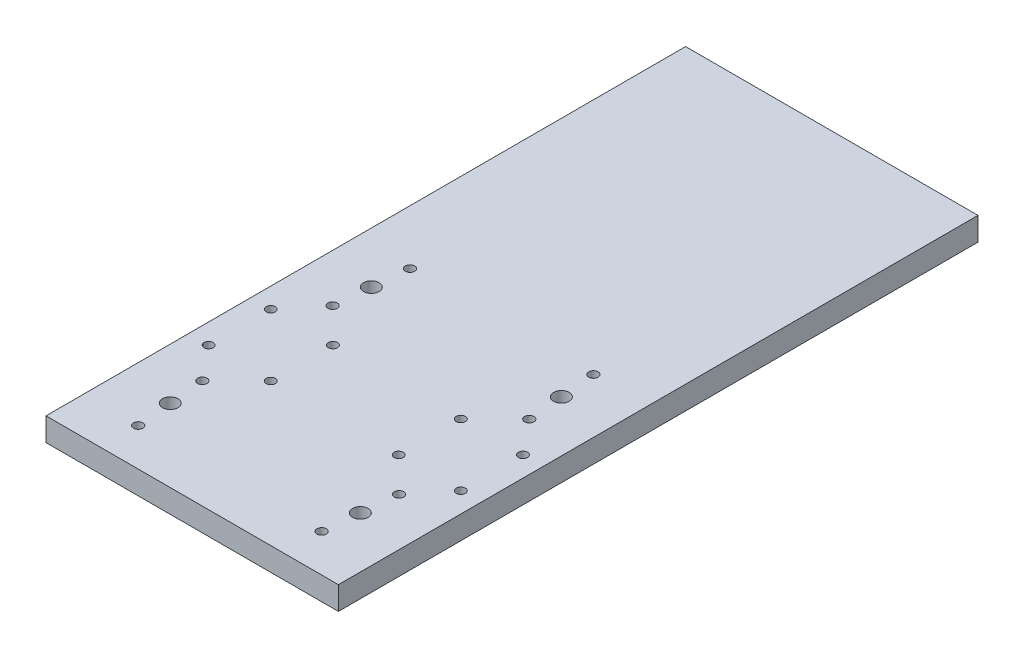
ISO-10303-21;
HEADER;
FILE_DESCRIPTION(('STEP AP214'),'2;1');
FILE_NAME('part.step','',(''),(''),'','','');
FILE_SCHEMA(('AUTOMOTIVE_DESIGN { 1 0 10303 214 1 1 1 1 }'));
ENDSEC;
DATA;
#1=APPLICATION_CONTEXT('core data for automotive mechanical design processes');
#2=APPLICATION_PROTOCOL_DEFINITION('international standard','automotive_design',2000,#1);
#3=PRODUCT_CONTEXT('',#1,'mechanical');
#4=PRODUCT('Part','Part','',(#3));
#5=PRODUCT_RELATED_PRODUCT_CATEGORY('part','',(#4));
#6=PRODUCT_DEFINITION_FORMATION('','',#4);
#7=PRODUCT_DEFINITION_CONTEXT('part definition',#1,'design');
#8=PRODUCT_DEFINITION('design','',#6,#7);
#9=PRODUCT_DEFINITION_SHAPE('','',#8);
#10=(LENGTH_UNIT() NAMED_UNIT(*) SI_UNIT(.MILLI.,.METRE.));
#11=(NAMED_UNIT(*) PLANE_ANGLE_UNIT() SI_UNIT($,.RADIAN.));
#12=(NAMED_UNIT(*) SI_UNIT($,.STERADIAN.) SOLID_ANGLE_UNIT());
#13=UNCERTAINTY_MEASURE_WITH_UNIT(LENGTH_MEASURE(1.E-05),#10,'distance_accuracy_value','');
#14=(GEOMETRIC_REPRESENTATION_CONTEXT(3) GLOBAL_UNCERTAINTY_ASSIGNED_CONTEXT((#13)) GLOBAL_UNIT_ASSIGNED_CONTEXT((#10,
#11,#12)) REPRESENTATION_CONTEXT('',''));
#15=CARTESIAN_POINT('',(0.,0.,0.));
#16=DIRECTION('',(0.,0.,1.));
#17=DIRECTION('',(1.,0.,0.));
#18=AXIS2_PLACEMENT_3D('',#15,#16,#17);
#19=CARTESIAN_POINT('',(0.,6.35,0.));
#20=DIRECTION('',(0.,1.,0.));
#21=DIRECTION('',(0.,0.,1.));
#22=AXIS2_PLACEMENT_3D('',#19,#20,#21);
#23=PLANE('',#22);
#24=CARTESIAN_POINT('',(69.,6.35,97.));
#25=DIRECTION('',(0.,1.,0.));
#26=DIRECTION('',(0.,0.,1.));
#27=AXIS2_PLACEMENT_3D('',#24,#25,#26);
#28=CIRCLE('',#27,2.49999999999999);
#29=CARTESIAN_POINT('',(69.,6.35,99.5));
#30=VERTEX_POINT('',#29);
#31=EDGE_CURVE('E230',#30,#30,#28,.T.);
#32=ORIENTED_EDGE('',*,*,#31,.F.);
#33=EDGE_LOOP('',(#32));
#34=FACE_BOUND('',#33,.T.);
#35=CARTESIAN_POINT('',(35.,6.35,63.));
#36=DIRECTION('',(0.,1.,0.));
#37=DIRECTION('',(0.,0.,1.));
#38=AXIS2_PLACEMENT_3D('',#35,#36,#37);
#39=CIRCLE('',#38,2.49999999999999);
#40=CARTESIAN_POINT('',(35.,6.35,65.5));
#41=VERTEX_POINT('',#40);
#42=EDGE_CURVE('E224',#41,#41,#39,.T.);
#43=ORIENTED_EDGE('',*,*,#42,.F.);
#44=EDGE_LOOP('',(#43));
#45=FACE_BOUND('',#44,.T.);
#46=CARTESIAN_POINT('',(35.,6.35,97.));
#47=DIRECTION('',(0.,1.,0.));
#48=DIRECTION('',(0.,0.,1.));
#49=AXIS2_PLACEMENT_3D('',#46,#47,#48);
#50=CIRCLE('',#49,2.49999999999999);
#51=CARTESIAN_POINT('',(35.,6.35,99.5));
#52=VERTEX_POINT('',#51);
#53=EDGE_CURVE('E218',#52,#52,#50,.T.);
#54=ORIENTED_EDGE('',*,*,#53,.F.);
#55=EDGE_LOOP('',(#54));
#56=FACE_BOUND('',#55,.T.);
#57=CARTESIAN_POINT('',(69.,6.35,63.));
#58=DIRECTION('',(0.,1.,0.));
#59=DIRECTION('',(0.,0.,1.));
#60=AXIS2_PLACEMENT_3D('',#57,#58,#59);
#61=CIRCLE('',#60,2.49999999999999);
#62=CARTESIAN_POINT('',(69.,6.35,65.5));
#63=VERTEX_POINT('',#62);
#64=EDGE_CURVE('E212',#63,#63,#61,.T.);
#65=ORIENTED_EDGE('',*,*,#64,.F.);
#66=EDGE_LOOP('',(#65));
#67=FACE_BOUND('',#66,.T.);
#68=CARTESIAN_POINT('',(-69.,6.35,63.));
#69=DIRECTION('',(0.,1.,0.));
#70=DIRECTION('',(0.,0.,1.));
#71=AXIS2_PLACEMENT_3D('',#68,#69,#70);
#72=CIRCLE('',#71,2.49999999999999);
#73=CARTESIAN_POINT('',(-69.,6.35,65.5));
#74=VERTEX_POINT('',#73);
#75=EDGE_CURVE('E206',#74,#74,#72,.T.);
#76=ORIENTED_EDGE('',*,*,#75,.F.);
#77=EDGE_LOOP('',(#76));
#78=FACE_BOUND('',#77,.T.);
#79=CARTESIAN_POINT('',(-35.,6.35,97.));
#80=DIRECTION('',(0.,1.,0.));
#81=DIRECTION('',(0.,0.,1.));
#82=AXIS2_PLACEMENT_3D('',#79,#80,#81);
#83=CIRCLE('',#82,2.49999999999999);
#84=CARTESIAN_POINT('',(-35.,6.35,99.5));
#85=VERTEX_POINT('',#84);
#86=EDGE_CURVE('E200',#85,#85,#83,.T.);
#87=ORIENTED_EDGE('',*,*,#86,.F.);
#88=EDGE_LOOP('',(#87));
#89=FACE_BOUND('',#88,.T.);
#90=CARTESIAN_POINT('',(-35.,6.35,63.));
#91=DIRECTION('',(0.,1.,0.));
#92=DIRECTION('',(0.,0.,1.));
#93=AXIS2_PLACEMENT_3D('',#90,#91,#92);
#94=CIRCLE('',#93,2.49999999999999);
#95=CARTESIAN_POINT('',(-35.,6.35,65.5));
#96=VERTEX_POINT('',#95);
#97=EDGE_CURVE('E194',#96,#96,#94,.T.);
#98=ORIENTED_EDGE('',*,*,#97,.F.);
#99=EDGE_LOOP('',(#98));
#100=FACE_BOUND('',#99,.T.);
#101=CARTESIAN_POINT('',(-69.,6.35,97.));
#102=DIRECTION('',(0.,1.,0.));
#103=DIRECTION('',(0.,0.,1.));
#104=AXIS2_PLACEMENT_3D('',#101,#102,#103);
#105=CIRCLE('',#104,2.49999999999999);
#106=CARTESIAN_POINT('',(-69.,6.35,99.5));
#107=VERTEX_POINT('',#106);
#108=EDGE_CURVE('E188',#107,#107,#105,.T.);
#109=ORIENTED_EDGE('',*,*,#108,.F.);
#110=EDGE_LOOP('',(#109));
#111=FACE_BOUND('',#110,.T.);
#112=CARTESIAN_POINT('',(50.1806296318612,6.35,154.364720278474));
#113=DIRECTION('',(0.,1.,0.));
#114=DIRECTION('',(0.,0.,1.));
#115=AXIS2_PLACEMENT_3D('',#112,#113,#114);
#116=CIRCLE('',#115,2.5527);
#117=CARTESIAN_POINT('',(50.1806296318612,6.35,156.917420278474));
#118=VERTEX_POINT('',#117);
#119=EDGE_CURVE('E182',#118,#118,#116,.T.);
#120=ORIENTED_EDGE('',*,*,#119,.F.);
#121=EDGE_LOOP('',(#120));
#122=FACE_BOUND('',#121,.T.);
#123=CARTESIAN_POINT('',(53.8193703681388,6.35,115.635279721526));
#124=DIRECTION('',(0.,1.,0.));
#125=DIRECTION('',(0.,0.,1.));
#126=AXIS2_PLACEMENT_3D('',#123,#124,#125);
#127=CIRCLE('',#126,2.5527);
#128=CARTESIAN_POINT('',(53.8193703681388,6.35,118.187979721526));
#129=VERTEX_POINT('',#128);
#130=EDGE_CURVE('E176',#129,#129,#127,.T.);
#131=ORIENTED_EDGE('',*,*,#130,.F.);
#132=EDGE_LOOP('',(#131));
#133=FACE_BOUND('',#132,.T.);
#134=CARTESIAN_POINT('',(50.1806296318611,6.35,5.63527972155062));
#135=DIRECTION('',(0.,1.,0.));
#136=DIRECTION('',(0.,0.,1.));
#137=AXIS2_PLACEMENT_3D('',#134,#135,#136);
#138=CIRCLE('',#137,2.5527);
#139=CARTESIAN_POINT('',(50.1806296318611,6.35,8.18797972155062));
#140=VERTEX_POINT('',#139);
#141=EDGE_CURVE('E170',#140,#140,#138,.T.);
#142=ORIENTED_EDGE('',*,*,#141,.F.);
#143=EDGE_LOOP('',(#142));
#144=FACE_BOUND('',#143,.T.);
#145=CARTESIAN_POINT('',(53.8193703681388,6.35,44.3647202784984));
#146=DIRECTION('',(0.,1.,0.));
#147=DIRECTION('',(0.,0.,1.));
#148=AXIS2_PLACEMENT_3D('',#145,#146,#147);
#149=CIRCLE('',#148,2.5527);
#150=CARTESIAN_POINT('',(53.8193703681388,6.35,46.9174202784984));
#151=VERTEX_POINT('',#150);
#152=EDGE_CURVE('E164',#151,#151,#149,.T.);
#153=ORIENTED_EDGE('',*,*,#152,.F.);
#154=EDGE_LOOP('',(#153));
#155=FACE_BOUND('',#154,.T.);
#156=CARTESIAN_POINT('',(-53.8193703680898,6.35,44.3647202784985));
#157=DIRECTION('',(0.,1.,0.));
#158=DIRECTION('',(0.,0.,1.));
#159=AXIS2_PLACEMENT_3D('',#156,#157,#158);
#160=CIRCLE('',#159,2.5527);
#161=CARTESIAN_POINT('',(-53.8193703680898,6.35,46.9174202784985));
#162=VERTEX_POINT('',#161);
#163=EDGE_CURVE('E158',#162,#162,#160,.T.);
#164=ORIENTED_EDGE('',*,*,#163,.F.);
#165=EDGE_LOOP('',(#164));
#166=FACE_BOUND('',#165,.T.);
#167=CARTESIAN_POINT('',(-50.1806296318122,6.35,5.63527972155065));
#168=DIRECTION('',(0.,1.,0.));
#169=DIRECTION('',(0.,0.,1.));
#170=AXIS2_PLACEMENT_3D('',#167,#168,#169);
#171=CIRCLE('',#170,2.5527);
#172=CARTESIAN_POINT('',(-50.1806296318122,6.35,8.18797972155064));
#173=VERTEX_POINT('',#172);
#174=EDGE_CURVE('E152',#173,#173,#171,.T.);
#175=ORIENTED_EDGE('',*,*,#174,.F.);
#176=EDGE_LOOP('',(#175));
#177=FACE_BOUND('',#176,.T.);
#178=CARTESIAN_POINT('',(-53.8193703680898,6.35,115.635279721526));
#179=DIRECTION('',(0.,1.,0.));
#180=DIRECTION('',(0.,0.,1.));
#181=AXIS2_PLACEMENT_3D('',#178,#179,#180);
#182=CIRCLE('',#181,2.5527);
#183=CARTESIAN_POINT('',(-53.8193703680898,6.35,118.187979721526));
#184=VERTEX_POINT('',#183);
#185=EDGE_CURVE('E146',#184,#184,#182,.T.);
#186=ORIENTED_EDGE('',*,*,#185,.F.);
#187=EDGE_LOOP('',(#186));
#188=FACE_BOUND('',#187,.T.);
#189=CARTESIAN_POINT('',(-50.1806296318121,6.35,154.364720278474));
#190=DIRECTION('',(0.,1.,0.));
#191=DIRECTION('',(0.,0.,1.));
#192=AXIS2_PLACEMENT_3D('',#189,#190,#191);
#193=CIRCLE('',#192,2.5527);
#194=CARTESIAN_POINT('',(-50.1806296318121,6.35,156.917420278474));
#195=VERTEX_POINT('',#194);
#196=EDGE_CURVE('E140',#195,#195,#193,.T.);
#197=ORIENTED_EDGE('',*,*,#196,.F.);
#198=EDGE_LOOP('',(#197));
#199=FACE_BOUND('',#198,.T.);
#200=CARTESIAN_POINT('',(-52.,6.35,135.));
#201=DIRECTION('',(0.,1.,0.));
#202=DIRECTION('',(0.,0.,-1.));
#203=AXIS2_PLACEMENT_3D('',#200,#201,#202);
#204=CIRCLE('',#203,4.25000000000002);
#205=CARTESIAN_POINT('',(-52.,6.35,130.75));
#206=VERTEX_POINT('',#205);
#207=EDGE_CURVE('E123',#206,#206,#204,.T.);
#208=ORIENTED_EDGE('',*,*,#207,.F.);
#209=EDGE_LOOP('',(#208));
#210=FACE_BOUND('',#209,.T.);
#211=CARTESIAN_POINT('',(52.,6.35,135.));
#212=DIRECTION('',(0.,1.,0.));
#213=DIRECTION('',(0.,0.,1.));
#214=AXIS2_PLACEMENT_3D('',#211,#212,#213);
#215=CIRCLE('',#214,4.25000000000002);
#216=CARTESIAN_POINT('',(52.,6.35,139.25));
#217=VERTEX_POINT('',#216);
#218=EDGE_CURVE('E102',#217,#217,#215,.T.);
#219=ORIENTED_EDGE('',*,*,#218,.F.);
#220=EDGE_LOOP('',(#219));
#221=FACE_BOUND('',#220,.T.);
#222=DIRECTION('',(0.,0.,1.));
#223=VECTOR('',#222,1.);
#224=CARTESIAN_POINT('',(-80.,6.35,175.));
#225=LINE('',#224,#223);
#226=CARTESIAN_POINT('',(-80.,6.35,-175.));
#227=VERTEX_POINT('',#226);
#228=CARTESIAN_POINT('',(-80.,6.35,175.));
#229=VERTEX_POINT('',#228);
#230=EDGE_CURVE('E87',#227,#229,#225,.T.);
#231=ORIENTED_EDGE('',*,*,#230,.T.);
#232=DIRECTION('',(1.,0.,0.));
#233=VECTOR('',#232,1.);
#234=CARTESIAN_POINT('',(80.,6.35,175.));
#235=LINE('',#234,#233);
#236=CARTESIAN_POINT('',(80.,6.35,175.));
#237=VERTEX_POINT('',#236);
#238=EDGE_CURVE('E82',#229,#237,#235,.T.);
#239=ORIENTED_EDGE('',*,*,#238,.T.);
#240=DIRECTION('',(0.,0.,-1.));
#241=VECTOR('',#240,1.);
#242=CARTESIAN_POINT('',(80.,6.35,175.));
#243=LINE('',#242,#241);
#244=CARTESIAN_POINT('',(80.,6.35,-175.));
#245=VERTEX_POINT('',#244);
#246=EDGE_CURVE('E85',#237,#245,#243,.T.);
#247=ORIENTED_EDGE('',*,*,#246,.T.);
#248=DIRECTION('',(-1.,0.,0.));
#249=VECTOR('',#248,1.);
#250=CARTESIAN_POINT('',(80.,6.35,-175.));
#251=LINE('',#250,#249);
#252=EDGE_CURVE('E52',#245,#227,#251,.T.);
#253=ORIENTED_EDGE('',*,*,#252,.T.);
#254=EDGE_LOOP('',(#231,#239,#247,#253));
#255=FACE_BOUND('',#254,.T.);
#256=CARTESIAN_POINT('',(52.,6.35,25.));
#257=DIRECTION('',(0.,1.,0.));
#258=DIRECTION('',(0.,0.,-1.));
#259=AXIS2_PLACEMENT_3D('',#256,#257,#258);
#260=CIRCLE('',#259,4.25000000000002);
#261=CARTESIAN_POINT('',(52.,6.35,20.75));
#262=VERTEX_POINT('',#261);
#263=EDGE_CURVE('E117',#262,#262,#260,.T.);
#264=ORIENTED_EDGE('',*,*,#263,.F.);
#265=EDGE_LOOP('',(#264));
#266=FACE_BOUND('',#265,.T.);
#267=CARTESIAN_POINT('',(-52.,6.35,25.));
#268=DIRECTION('',(0.,1.,0.));
#269=DIRECTION('',(0.,0.,1.));
#270=AXIS2_PLACEMENT_3D('',#267,#268,#269);
#271=CIRCLE('',#270,4.25000000000002);
#272=CARTESIAN_POINT('',(-52.,6.35,29.25));
#273=VERTEX_POINT('',#272);
#274=EDGE_CURVE('E129',#273,#273,#271,.T.);
#275=ORIENTED_EDGE('',*,*,#274,.F.);
#276=EDGE_LOOP('',(#275));
#277=FACE_BOUND('',#276,.T.);
#278=ADVANCED_FACE('F35',(#34,#45,#56,#67,#78,#89,#100,#111,#122,#133,#144,#155,#166,#177,#188,
#199,#210,#221,#255,#266,#277),#23,.T.);
#279=CARTESIAN_POINT('',(0.,-6.35,0.));
#280=DIRECTION('',(0.,1.,0.));
#281=DIRECTION('',(0.,0.,1.));
#282=AXIS2_PLACEMENT_3D('',#279,#280,#281);
#283=PLANE('',#282);
#284=CARTESIAN_POINT('',(69.,-6.35,97.));
#285=DIRECTION('',(0.,1.,0.));
#286=DIRECTION('',(0.,0.,1.));
#287=AXIS2_PLACEMENT_3D('',#284,#285,#286);
#288=CIRCLE('',#287,2.5);
#289=CARTESIAN_POINT('',(69.,-6.35,99.5));
#290=VERTEX_POINT('',#289);
#291=EDGE_CURVE('E227',#290,#290,#288,.T.);
#292=ORIENTED_EDGE('',*,*,#291,.T.);
#293=EDGE_LOOP('',(#292));
#294=FACE_BOUND('',#293,.T.);
#295=CARTESIAN_POINT('',(35.,-6.35,63.));
#296=DIRECTION('',(0.,1.,0.));
#297=DIRECTION('',(0.,0.,1.));
#298=AXIS2_PLACEMENT_3D('',#295,#296,#297);
#299=CIRCLE('',#298,2.5);
#300=CARTESIAN_POINT('',(35.,-6.35,65.5));
#301=VERTEX_POINT('',#300);
#302=EDGE_CURVE('E221',#301,#301,#299,.T.);
#303=ORIENTED_EDGE('',*,*,#302,.T.);
#304=EDGE_LOOP('',(#303));
#305=FACE_BOUND('',#304,.T.);
#306=CARTESIAN_POINT('',(35.,-6.35,97.));
#307=DIRECTION('',(0.,1.,0.));
#308=DIRECTION('',(0.,0.,1.));
#309=AXIS2_PLACEMENT_3D('',#306,#307,#308);
#310=CIRCLE('',#309,2.5);
#311=CARTESIAN_POINT('',(35.,-6.35,99.5));
#312=VERTEX_POINT('',#311);
#313=EDGE_CURVE('E215',#312,#312,#310,.T.);
#314=ORIENTED_EDGE('',*,*,#313,.T.);
#315=EDGE_LOOP('',(#314));
#316=FACE_BOUND('',#315,.T.);
#317=CARTESIAN_POINT('',(69.,-6.35,63.));
#318=DIRECTION('',(0.,1.,0.));
#319=DIRECTION('',(0.,0.,1.));
#320=AXIS2_PLACEMENT_3D('',#317,#318,#319);
#321=CIRCLE('',#320,2.5);
#322=CARTESIAN_POINT('',(69.,-6.35,65.5));
#323=VERTEX_POINT('',#322);
#324=EDGE_CURVE('E209',#323,#323,#321,.T.);
#325=ORIENTED_EDGE('',*,*,#324,.T.);
#326=EDGE_LOOP('',(#325));
#327=FACE_BOUND('',#326,.T.);
#328=CARTESIAN_POINT('',(-69.,-6.35,63.));
#329=DIRECTION('',(0.,1.,0.));
#330=DIRECTION('',(0.,0.,1.));
#331=AXIS2_PLACEMENT_3D('',#328,#329,#330);
#332=CIRCLE('',#331,2.5);
#333=CARTESIAN_POINT('',(-69.,-6.35,65.5));
#334=VERTEX_POINT('',#333);
#335=EDGE_CURVE('E203',#334,#334,#332,.T.);
#336=ORIENTED_EDGE('',*,*,#335,.T.);
#337=EDGE_LOOP('',(#336));
#338=FACE_BOUND('',#337,.T.);
#339=CARTESIAN_POINT('',(-35.,-6.35,97.));
#340=DIRECTION('',(0.,1.,0.));
#341=DIRECTION('',(0.,0.,1.));
#342=AXIS2_PLACEMENT_3D('',#339,#340,#341);
#343=CIRCLE('',#342,2.5);
#344=CARTESIAN_POINT('',(-35.,-6.35,99.5));
#345=VERTEX_POINT('',#344);
#346=EDGE_CURVE('E197',#345,#345,#343,.T.);
#347=ORIENTED_EDGE('',*,*,#346,.T.);
#348=EDGE_LOOP('',(#347));
#349=FACE_BOUND('',#348,.T.);
#350=CARTESIAN_POINT('',(-35.,-6.35,63.));
#351=DIRECTION('',(0.,1.,0.));
#352=DIRECTION('',(0.,0.,1.));
#353=AXIS2_PLACEMENT_3D('',#350,#351,#352);
#354=CIRCLE('',#353,2.5);
#355=CARTESIAN_POINT('',(-35.,-6.35,65.5));
#356=VERTEX_POINT('',#355);
#357=EDGE_CURVE('E191',#356,#356,#354,.T.);
#358=ORIENTED_EDGE('',*,*,#357,.T.);
#359=EDGE_LOOP('',(#358));
#360=FACE_BOUND('',#359,.T.);
#361=CARTESIAN_POINT('',(-69.,-6.35,97.));
#362=DIRECTION('',(0.,1.,0.));
#363=DIRECTION('',(0.,0.,1.));
#364=AXIS2_PLACEMENT_3D('',#361,#362,#363);
#365=CIRCLE('',#364,2.5);
#366=CARTESIAN_POINT('',(-69.,-6.35,99.5));
#367=VERTEX_POINT('',#366);
#368=EDGE_CURVE('E185',#367,#367,#365,.T.);
#369=ORIENTED_EDGE('',*,*,#368,.T.);
#370=EDGE_LOOP('',(#369));
#371=FACE_BOUND('',#370,.T.);
#372=CARTESIAN_POINT('',(50.1806296318612,-6.35,154.364720278474));
#373=DIRECTION('',(0.,1.,0.));
#374=DIRECTION('',(0.,0.,1.));
#375=AXIS2_PLACEMENT_3D('',#372,#373,#374);
#376=CIRCLE('',#375,2.5527);
#377=CARTESIAN_POINT('',(50.1806296318612,-6.35,156.917420278474));
#378=VERTEX_POINT('',#377);
#379=EDGE_CURVE('E179',#378,#378,#376,.T.);
#380=ORIENTED_EDGE('',*,*,#379,.T.);
#381=EDGE_LOOP('',(#380));
#382=FACE_BOUND('',#381,.T.);
#383=CARTESIAN_POINT('',(53.8193703681388,-6.35,115.635279721526));
#384=DIRECTION('',(0.,1.,0.));
#385=DIRECTION('',(0.,0.,1.));
#386=AXIS2_PLACEMENT_3D('',#383,#384,#385);
#387=CIRCLE('',#386,2.5527);
#388=CARTESIAN_POINT('',(53.8193703681388,-6.35,118.187979721526));
#389=VERTEX_POINT('',#388);
#390=EDGE_CURVE('E173',#389,#389,#387,.T.);
#391=ORIENTED_EDGE('',*,*,#390,.T.);
#392=EDGE_LOOP('',(#391));
#393=FACE_BOUND('',#392,.T.);
#394=CARTESIAN_POINT('',(50.1806296318611,-6.35,5.63527972155062));
#395=DIRECTION('',(0.,1.,0.));
#396=DIRECTION('',(0.,0.,1.));
#397=AXIS2_PLACEMENT_3D('',#394,#395,#396);
#398=CIRCLE('',#397,2.5527);
#399=CARTESIAN_POINT('',(50.1806296318611,-6.35,8.18797972155062));
#400=VERTEX_POINT('',#399);
#401=EDGE_CURVE('E167',#400,#400,#398,.T.);
#402=ORIENTED_EDGE('',*,*,#401,.T.);
#403=EDGE_LOOP('',(#402));
#404=FACE_BOUND('',#403,.T.);
#405=CARTESIAN_POINT('',(53.8193703681388,-6.35,44.3647202784984));
#406=DIRECTION('',(0.,1.,0.));
#407=DIRECTION('',(0.,0.,1.));
#408=AXIS2_PLACEMENT_3D('',#405,#406,#407);
#409=CIRCLE('',#408,2.5527);
#410=CARTESIAN_POINT('',(53.8193703681388,-6.35,46.9174202784984));
#411=VERTEX_POINT('',#410);
#412=EDGE_CURVE('E161',#411,#411,#409,.T.);
#413=ORIENTED_EDGE('',*,*,#412,.T.);
#414=EDGE_LOOP('',(#413));
#415=FACE_BOUND('',#414,.T.);
#416=CARTESIAN_POINT('',(-53.8193703680898,-6.35,44.3647202784985));
#417=DIRECTION('',(0.,1.,0.));
#418=DIRECTION('',(0.,0.,1.));
#419=AXIS2_PLACEMENT_3D('',#416,#417,#418);
#420=CIRCLE('',#419,2.5527);
#421=CARTESIAN_POINT('',(-53.8193703680898,-6.35,46.9174202784985));
#422=VERTEX_POINT('',#421);
#423=EDGE_CURVE('E155',#422,#422,#420,.T.);
#424=ORIENTED_EDGE('',*,*,#423,.T.);
#425=EDGE_LOOP('',(#424));
#426=FACE_BOUND('',#425,.T.);
#427=CARTESIAN_POINT('',(-50.1806296318122,-6.35,5.63527972155065));
#428=DIRECTION('',(0.,1.,0.));
#429=DIRECTION('',(0.,0.,1.));
#430=AXIS2_PLACEMENT_3D('',#427,#428,#429);
#431=CIRCLE('',#430,2.5527);
#432=CARTESIAN_POINT('',(-50.1806296318122,-6.35,8.18797972155064));
#433=VERTEX_POINT('',#432);
#434=EDGE_CURVE('E149',#433,#433,#431,.T.);
#435=ORIENTED_EDGE('',*,*,#434,.T.);
#436=EDGE_LOOP('',(#435));
#437=FACE_BOUND('',#436,.T.);
#438=CARTESIAN_POINT('',(-53.8193703680898,-6.35,115.635279721526));
#439=DIRECTION('',(0.,1.,0.));
#440=DIRECTION('',(0.,0.,1.));
#441=AXIS2_PLACEMENT_3D('',#438,#439,#440);
#442=CIRCLE('',#441,2.5527);
#443=CARTESIAN_POINT('',(-53.8193703680898,-6.35,118.187979721526));
#444=VERTEX_POINT('',#443);
#445=EDGE_CURVE('E143',#444,#444,#442,.T.);
#446=ORIENTED_EDGE('',*,*,#445,.T.);
#447=EDGE_LOOP('',(#446));
#448=FACE_BOUND('',#447,.T.);
#449=CARTESIAN_POINT('',(-50.1806296318121,-6.35,154.364720278474));
#450=DIRECTION('',(0.,1.,0.));
#451=DIRECTION('',(0.,0.,1.));
#452=AXIS2_PLACEMENT_3D('',#449,#450,#451);
#453=CIRCLE('',#452,2.5527);
#454=CARTESIAN_POINT('',(-50.1806296318121,-6.35,156.917420278474));
#455=VERTEX_POINT('',#454);
#456=EDGE_CURVE('E135',#455,#455,#453,.T.);
#457=ORIENTED_EDGE('',*,*,#456,.T.);
#458=EDGE_LOOP('',(#457));
#459=FACE_BOUND('',#458,.T.);
#460=DIRECTION('',(0.,0.,1.));
#461=VECTOR('',#460,1.);
#462=CARTESIAN_POINT('',(-80.,-6.35,175.));
#463=LINE('',#462,#461);
#464=CARTESIAN_POINT('',(-80.,-6.35,-175.));
#465=VERTEX_POINT('',#464);
#466=CARTESIAN_POINT('',(-80.,-6.35,175.));
#467=VERTEX_POINT('',#466);
#468=EDGE_CURVE('E99',#465,#467,#463,.T.);
#469=ORIENTED_EDGE('',*,*,#468,.F.);
#470=DIRECTION('',(-1.,0.,0.));
#471=VECTOR('',#470,1.);
#472=CARTESIAN_POINT('',(80.,-6.35,-175.));
#473=LINE('',#472,#471);
#474=CARTESIAN_POINT('',(80.,-6.35,-175.));
#475=VERTEX_POINT('',#474);
#476=EDGE_CURVE('E75',#475,#465,#473,.T.);
#477=ORIENTED_EDGE('',*,*,#476,.F.);
#478=DIRECTION('',(0.,0.,-1.));
#479=VECTOR('',#478,1.);
#480=CARTESIAN_POINT('',(80.,-6.35,175.));
#481=LINE('',#480,#479);
#482=CARTESIAN_POINT('',(80.,-6.35,175.));
#483=VERTEX_POINT('',#482);
#484=EDGE_CURVE('E69',#483,#475,#481,.T.);
#485=ORIENTED_EDGE('',*,*,#484,.F.);
#486=DIRECTION('',(1.,0.,0.));
#487=VECTOR('',#486,1.);
#488=CARTESIAN_POINT('',(80.,-6.35,175.));
#489=LINE('',#488,#487);
#490=EDGE_CURVE('E91',#467,#483,#489,.T.);
#491=ORIENTED_EDGE('',*,*,#490,.F.);
#492=EDGE_LOOP('',(#469,#477,#485,#491));
#493=FACE_BOUND('',#492,.T.);
#494=CARTESIAN_POINT('',(52.,-6.35,135.));
#495=DIRECTION('',(0.,1.,0.));
#496=DIRECTION('',(0.,0.,1.));
#497=AXIS2_PLACEMENT_3D('',#494,#495,#496);
#498=CIRCLE('',#497,4.25000000000002);
#499=CARTESIAN_POINT('',(52.,-6.35,139.25));
#500=VERTEX_POINT('',#499);
#501=EDGE_CURVE('E114',#500,#500,#498,.T.);
#502=ORIENTED_EDGE('',*,*,#501,.T.);
#503=EDGE_LOOP('',(#502));
#504=FACE_BOUND('',#503,.T.);
#505=CARTESIAN_POINT('',(52.,-6.35,25.));
#506=DIRECTION('',(0.,1.,0.));
#507=DIRECTION('',(0.,0.,-1.));
#508=AXIS2_PLACEMENT_3D('',#505,#506,#507);
#509=CIRCLE('',#508,4.25000000000002);
#510=CARTESIAN_POINT('',(52.,-6.35,20.75));
#511=VERTEX_POINT('',#510);
#512=EDGE_CURVE('E120',#511,#511,#509,.T.);
#513=ORIENTED_EDGE('',*,*,#512,.T.);
#514=EDGE_LOOP('',(#513));
#515=FACE_BOUND('',#514,.T.);
#516=CARTESIAN_POINT('',(-52.,-6.35,135.));
#517=DIRECTION('',(0.,1.,0.));
#518=DIRECTION('',(0.,0.,-1.));
#519=AXIS2_PLACEMENT_3D('',#516,#517,#518);
#520=CIRCLE('',#519,4.25000000000002);
#521=CARTESIAN_POINT('',(-52.,-6.35,130.75));
#522=VERTEX_POINT('',#521);
#523=EDGE_CURVE('E126',#522,#522,#520,.T.);
#524=ORIENTED_EDGE('',*,*,#523,.T.);
#525=EDGE_LOOP('',(#524));
#526=FACE_BOUND('',#525,.T.);
#527=CARTESIAN_POINT('',(-52.,-6.35,25.));
#528=DIRECTION('',(0.,1.,0.));
#529=DIRECTION('',(0.,0.,1.));
#530=AXIS2_PLACEMENT_3D('',#527,#528,#529);
#531=CIRCLE('',#530,4.25000000000002);
#532=CARTESIAN_POINT('',(-52.,-6.35,29.25));
#533=VERTEX_POINT('',#532);
#534=EDGE_CURVE('E132',#533,#533,#531,.T.);
#535=ORIENTED_EDGE('',*,*,#534,.T.);
#536=EDGE_LOOP('',(#535));
#537=FACE_BOUND('',#536,.T.);
#538=ADVANCED_FACE('F110',(#294,#305,#316,#327,#338,#349,#360,#371,#382,#393,#404,#415,#426,
#437,#448,#459,#493,#504,#515,#526,#537),#283,.F.);
#539=CARTESIAN_POINT('',(-80.,6.35,175.));
#540=DIRECTION('',(1.,0.,0.));
#541=DIRECTION('',(0.,0.,-1.));
#542=AXIS2_PLACEMENT_3D('',#539,#540,#541);
#543=PLANE('',#542);
#544=ORIENTED_EDGE('',*,*,#468,.T.);
#545=DIRECTION('',(0.,-1.,0.));
#546=VECTOR('',#545,1.);
#547=CARTESIAN_POINT('',(-80.,6.35,175.));
#548=LINE('',#547,#546);
#549=EDGE_CURVE('E11',#229,#467,#548,.T.);
#550=ORIENTED_EDGE('',*,*,#549,.F.);
#551=ORIENTED_EDGE('',*,*,#230,.F.);
#552=DIRECTION('',(0.,-1.,0.));
#553=VECTOR('',#552,1.);
#554=CARTESIAN_POINT('',(-80.,6.35,-175.));
#555=LINE('',#554,#553);
#556=EDGE_CURVE('E95',#227,#465,#555,.T.);
#557=ORIENTED_EDGE('',*,*,#556,.T.);
#558=EDGE_LOOP('',(#544,#550,#551,#557));
#559=FACE_BOUND('',#558,.T.);
#560=ADVANCED_FACE('F37',(#559),#543,.F.);
#561=CARTESIAN_POINT('',(80.,6.35,175.));
#562=DIRECTION('',(0.,0.,-1.));
#563=DIRECTION('',(-1.,0.,0.));
#564=AXIS2_PLACEMENT_3D('',#561,#562,#563);
#565=PLANE('',#564);
#566=ORIENTED_EDGE('',*,*,#490,.T.);
#567=DIRECTION('',(0.,-1.,0.));
#568=VECTOR('',#567,1.);
#569=CARTESIAN_POINT('',(80.,6.35,175.));
#570=LINE('',#569,#568);
#571=EDGE_CURVE('E44',#237,#483,#570,.T.);
#572=ORIENTED_EDGE('',*,*,#571,.F.);
#573=ORIENTED_EDGE('',*,*,#238,.F.);
#574=ORIENTED_EDGE('',*,*,#549,.T.);
#575=EDGE_LOOP('',(#566,#572,#573,#574));
#576=FACE_BOUND('',#575,.T.);
#577=ADVANCED_FACE('F90',(#576),#565,.F.);
#578=CARTESIAN_POINT('',(80.,6.35,175.));
#579=DIRECTION('',(-1.,0.,0.));
#580=DIRECTION('',(0.,0.,1.));
#581=AXIS2_PLACEMENT_3D('',#578,#579,#580);
#582=PLANE('',#581);
#583=ORIENTED_EDGE('',*,*,#484,.T.);
#584=DIRECTION('',(0.,-1.,0.));
#585=VECTOR('',#584,1.);
#586=CARTESIAN_POINT('',(80.,6.35,-175.));
#587=LINE('',#586,#585);
#588=EDGE_CURVE('E92',#245,#475,#587,.T.);
#589=ORIENTED_EDGE('',*,*,#588,.F.);
#590=ORIENTED_EDGE('',*,*,#246,.F.);
#591=ORIENTED_EDGE('',*,*,#571,.T.);
#592=EDGE_LOOP('',(#583,#589,#590,#591));
#593=FACE_BOUND('',#592,.T.);
#594=ADVANCED_FACE('F93',(#593),#582,.F.);
#595=CARTESIAN_POINT('',(80.,6.35,-175.));
#596=DIRECTION('',(0.,0.,1.));
#597=DIRECTION('',(1.,0.,0.));
#598=AXIS2_PLACEMENT_3D('',#595,#596,#597);
#599=PLANE('',#598);
#600=ORIENTED_EDGE('',*,*,#476,.T.);
#601=ORIENTED_EDGE('',*,*,#556,.F.);
#602=ORIENTED_EDGE('',*,*,#252,.F.);
#603=ORIENTED_EDGE('',*,*,#588,.T.);
#604=EDGE_LOOP('',(#600,#601,#602,#603));
#605=FACE_BOUND('',#604,.T.);
#606=ADVANCED_FACE('F107',(#605),#599,.F.);
#607=CARTESIAN_POINT('',(52.,6.35,135.));
#608=DIRECTION('',(0.,-1.,0.));
#609=DIRECTION('',(0.,0.,-1.));
#610=AXIS2_PLACEMENT_3D('',#607,#608,#609);
#611=CYLINDRICAL_SURFACE('',#610,4.25000000000002);
#612=ORIENTED_EDGE('',*,*,#218,.T.);
#613=EDGE_LOOP('',(#612));
#614=FACE_BOUND('',#613,.T.);
#615=ORIENTED_EDGE('',*,*,#501,.F.);
#616=EDGE_LOOP('',(#615));
#617=FACE_BOUND('',#616,.T.);
#618=ADVANCED_FACE('F273',(#614,#617),#611,.F.);
#619=CARTESIAN_POINT('',(52.,6.35,25.));
#620=DIRECTION('',(0.,-1.,0.));
#621=DIRECTION('',(0.,0.,-1.));
#622=AXIS2_PLACEMENT_3D('',#619,#620,#621);
#623=CYLINDRICAL_SURFACE('',#622,4.25000000000002);
#624=ORIENTED_EDGE('',*,*,#263,.T.);
#625=EDGE_LOOP('',(#624));
#626=FACE_BOUND('',#625,.T.);
#627=ORIENTED_EDGE('',*,*,#512,.F.);
#628=EDGE_LOOP('',(#627));
#629=FACE_BOUND('',#628,.T.);
#630=ADVANCED_FACE('F276',(#626,#629),#623,.F.);
#631=CARTESIAN_POINT('',(-52.,6.35,135.));
#632=DIRECTION('',(0.,-1.,0.));
#633=DIRECTION('',(0.,0.,-1.));
#634=AXIS2_PLACEMENT_3D('',#631,#632,#633);
#635=CYLINDRICAL_SURFACE('',#634,4.25000000000002);
#636=ORIENTED_EDGE('',*,*,#207,.T.);
#637=EDGE_LOOP('',(#636));
#638=FACE_BOUND('',#637,.T.);
#639=ORIENTED_EDGE('',*,*,#523,.F.);
#640=EDGE_LOOP('',(#639));
#641=FACE_BOUND('',#640,.T.);
#642=ADVANCED_FACE('F292',(#638,#641),#635,.F.);
#643=CARTESIAN_POINT('',(-52.,6.35,25.));
#644=DIRECTION('',(0.,-1.,0.));
#645=DIRECTION('',(0.,0.,-1.));
#646=AXIS2_PLACEMENT_3D('',#643,#644,#645);
#647=CYLINDRICAL_SURFACE('',#646,4.25000000000002);
#648=ORIENTED_EDGE('',*,*,#274,.T.);
#649=EDGE_LOOP('',(#648));
#650=FACE_BOUND('',#649,.T.);
#651=ORIENTED_EDGE('',*,*,#534,.F.);
#652=EDGE_LOOP('',(#651));
#653=FACE_BOUND('',#652,.T.);
#654=ADVANCED_FACE('F289',(#650,#653),#647,.F.);
#655=CARTESIAN_POINT('',(-50.1806296318121,6.35,154.364720278474));
#656=DIRECTION('',(0.,1.,0.));
#657=DIRECTION('',(0.,0.,1.));
#658=AXIS2_PLACEMENT_3D('',#655,#656,#657);
#659=CYLINDRICAL_SURFACE('',#658,2.5527);
#660=ORIENTED_EDGE('',*,*,#456,.F.);
#661=EDGE_LOOP('',(#660));
#662=FACE_BOUND('',#661,.T.);
#663=ORIENTED_EDGE('',*,*,#196,.T.);
#664=EDGE_LOOP('',(#663));
#665=FACE_BOUND('',#664,.T.);
#666=ADVANCED_FACE('F291',(#662,#665),#659,.F.);
#667=CARTESIAN_POINT('',(-53.8193703680898,6.35,115.635279721526));
#668=DIRECTION('',(0.,1.,0.));
#669=DIRECTION('',(0.,0.,1.));
#670=AXIS2_PLACEMENT_3D('',#667,#668,#669);
#671=CYLINDRICAL_SURFACE('',#670,2.5527);
#672=ORIENTED_EDGE('',*,*,#445,.F.);
#673=EDGE_LOOP('',(#672));
#674=FACE_BOUND('',#673,.T.);
#675=ORIENTED_EDGE('',*,*,#185,.T.);
#676=EDGE_LOOP('',(#675));
#677=FACE_BOUND('',#676,.T.);
#678=ADVANCED_FACE('F299',(#674,#677),#671,.F.);
#679=CARTESIAN_POINT('',(-50.1806296318122,6.35,5.63527972155065));
#680=DIRECTION('',(0.,1.,0.));
#681=DIRECTION('',(0.,0.,1.));
#682=AXIS2_PLACEMENT_3D('',#679,#680,#681);
#683=CYLINDRICAL_SURFACE('',#682,2.5527);
#684=ORIENTED_EDGE('',*,*,#434,.F.);
#685=EDGE_LOOP('',(#684));
#686=FACE_BOUND('',#685,.T.);
#687=ORIENTED_EDGE('',*,*,#174,.T.);
#688=EDGE_LOOP('',(#687));
#689=FACE_BOUND('',#688,.T.);
#690=ADVANCED_FACE('F387',(#686,#689),#683,.F.);
#691=CARTESIAN_POINT('',(-53.8193703680898,6.35,44.3647202784985));
#692=DIRECTION('',(0.,1.,0.));
#693=DIRECTION('',(0.,0.,1.));
#694=AXIS2_PLACEMENT_3D('',#691,#692,#693);
#695=CYLINDRICAL_SURFACE('',#694,2.5527);
#696=ORIENTED_EDGE('',*,*,#423,.F.);
#697=EDGE_LOOP('',(#696));
#698=FACE_BOUND('',#697,.T.);
#699=ORIENTED_EDGE('',*,*,#163,.T.);
#700=EDGE_LOOP('',(#699));
#701=FACE_BOUND('',#700,.T.);
#702=ADVANCED_FACE('F376',(#698,#701),#695,.F.);
#703=CARTESIAN_POINT('',(53.8193703681388,6.35,44.3647202784984));
#704=DIRECTION('',(0.,1.,0.));
#705=DIRECTION('',(0.,0.,1.));
#706=AXIS2_PLACEMENT_3D('',#703,#704,#705);
#707=CYLINDRICAL_SURFACE('',#706,2.5527);
#708=ORIENTED_EDGE('',*,*,#412,.F.);
#709=EDGE_LOOP('',(#708));
#710=FACE_BOUND('',#709,.T.);
#711=ORIENTED_EDGE('',*,*,#152,.T.);
#712=EDGE_LOOP('',(#711));
#713=FACE_BOUND('',#712,.T.);
#714=ADVANCED_FACE('F363',(#710,#713),#707,.F.);
#715=CARTESIAN_POINT('',(50.1806296318611,6.35,5.63527972155062));
#716=DIRECTION('',(0.,1.,0.));
#717=DIRECTION('',(0.,0.,1.));
#718=AXIS2_PLACEMENT_3D('',#715,#716,#717);
#719=CYLINDRICAL_SURFACE('',#718,2.5527);
#720=ORIENTED_EDGE('',*,*,#401,.F.);
#721=EDGE_LOOP('',(#720));
#722=FACE_BOUND('',#721,.T.);
#723=ORIENTED_EDGE('',*,*,#141,.T.);
#724=EDGE_LOOP('',(#723));
#725=FACE_BOUND('',#724,.T.);
#726=ADVANCED_FACE('F351',(#722,#725),#719,.F.);
#727=CARTESIAN_POINT('',(53.8193703681388,6.35,115.635279721526));
#728=DIRECTION('',(0.,1.,0.));
#729=DIRECTION('',(0.,0.,1.));
#730=AXIS2_PLACEMENT_3D('',#727,#728,#729);
#731=CYLINDRICAL_SURFACE('',#730,2.5527);
#732=ORIENTED_EDGE('',*,*,#390,.F.);
#733=EDGE_LOOP('',(#732));
#734=FACE_BOUND('',#733,.T.);
#735=ORIENTED_EDGE('',*,*,#130,.T.);
#736=EDGE_LOOP('',(#735));
#737=FACE_BOUND('',#736,.T.);
#738=ADVANCED_FACE('F339',(#734,#737),#731,.F.);
#739=CARTESIAN_POINT('',(50.1806296318612,6.35,154.364720278474));
#740=DIRECTION('',(0.,1.,0.));
#741=DIRECTION('',(0.,0.,1.));
#742=AXIS2_PLACEMENT_3D('',#739,#740,#741);
#743=CYLINDRICAL_SURFACE('',#742,2.5527);
#744=ORIENTED_EDGE('',*,*,#379,.F.);
#745=EDGE_LOOP('',(#744));
#746=FACE_BOUND('',#745,.T.);
#747=ORIENTED_EDGE('',*,*,#119,.T.);
#748=EDGE_LOOP('',(#747));
#749=FACE_BOUND('',#748,.T.);
#750=ADVANCED_FACE('F332',(#746,#749),#743,.F.);
#751=CARTESIAN_POINT('',(-69.,6.35,97.));
#752=DIRECTION('',(0.,1.,0.));
#753=DIRECTION('',(0.,0.,1.));
#754=AXIS2_PLACEMENT_3D('',#751,#752,#753);
#755=CYLINDRICAL_SURFACE('',#754,2.5);
#756=ORIENTED_EDGE('',*,*,#368,.F.);
#757=EDGE_LOOP('',(#756));
#758=FACE_BOUND('',#757,.T.);
#759=ORIENTED_EDGE('',*,*,#108,.T.);
#760=EDGE_LOOP('',(#759));
#761=FACE_BOUND('',#760,.T.);
#762=ADVANCED_FACE('F338',(#758,#761),#755,.F.);
#763=CARTESIAN_POINT('',(-35.,6.35,63.));
#764=DIRECTION('',(0.,1.,0.));
#765=DIRECTION('',(0.,0.,1.));
#766=AXIS2_PLACEMENT_3D('',#763,#764,#765);
#767=CYLINDRICAL_SURFACE('',#766,2.49999999999999);
#768=ORIENTED_EDGE('',*,*,#357,.F.);
#769=EDGE_LOOP('',(#768));
#770=FACE_BOUND('',#769,.T.);
#771=ORIENTED_EDGE('',*,*,#97,.T.);
#772=EDGE_LOOP('',(#771));
#773=FACE_BOUND('',#772,.T.);
#774=ADVANCED_FACE('F470',(#770,#773),#767,.F.);
#775=CARTESIAN_POINT('',(-35.,6.35,97.));
#776=DIRECTION('',(0.,1.,0.));
#777=DIRECTION('',(0.,0.,1.));
#778=AXIS2_PLACEMENT_3D('',#775,#776,#777);
#779=CYLINDRICAL_SURFACE('',#778,2.49999999999999);
#780=ORIENTED_EDGE('',*,*,#346,.F.);
#781=EDGE_LOOP('',(#780));
#782=FACE_BOUND('',#781,.T.);
#783=ORIENTED_EDGE('',*,*,#86,.T.);
#784=EDGE_LOOP('',(#783));
#785=FACE_BOUND('',#784,.T.);
#786=ADVANCED_FACE('F478',(#782,#785),#779,.F.);
#787=CARTESIAN_POINT('',(-69.,6.35,63.));
#788=DIRECTION('',(0.,1.,0.));
#789=DIRECTION('',(0.,0.,1.));
#790=AXIS2_PLACEMENT_3D('',#787,#788,#789);
#791=CYLINDRICAL_SURFACE('',#790,2.5);
#792=ORIENTED_EDGE('',*,*,#335,.F.);
#793=EDGE_LOOP('',(#792));
#794=FACE_BOUND('',#793,.T.);
#795=ORIENTED_EDGE('',*,*,#75,.T.);
#796=EDGE_LOOP('',(#795));
#797=FACE_BOUND('',#796,.T.);
#798=ADVANCED_FACE('F486',(#794,#797),#791,.F.);
#799=CARTESIAN_POINT('',(69.,6.35,63.));
#800=DIRECTION('',(0.,1.,0.));
#801=DIRECTION('',(0.,0.,1.));
#802=AXIS2_PLACEMENT_3D('',#799,#800,#801);
#803=CYLINDRICAL_SURFACE('',#802,2.5);
#804=ORIENTED_EDGE('',*,*,#324,.F.);
#805=EDGE_LOOP('',(#804));
#806=FACE_BOUND('',#805,.T.);
#807=ORIENTED_EDGE('',*,*,#64,.T.);
#808=EDGE_LOOP('',(#807));
#809=FACE_BOUND('',#808,.T.);
#810=ADVANCED_FACE('F493',(#806,#809),#803,.F.);
#811=CARTESIAN_POINT('',(35.,6.35,97.));
#812=DIRECTION('',(0.,1.,0.));
#813=DIRECTION('',(0.,0.,1.));
#814=AXIS2_PLACEMENT_3D('',#811,#812,#813);
#815=CYLINDRICAL_SURFACE('',#814,2.49999999999999);
#816=ORIENTED_EDGE('',*,*,#313,.F.);
#817=EDGE_LOOP('',(#816));
#818=FACE_BOUND('',#817,.T.);
#819=ORIENTED_EDGE('',*,*,#53,.T.);
#820=EDGE_LOOP('',(#819));
#821=FACE_BOUND('',#820,.T.);
#822=ADVANCED_FACE('F501',(#818,#821),#815,.F.);
#823=CARTESIAN_POINT('',(35.,6.35,63.));
#824=DIRECTION('',(0.,1.,0.));
#825=DIRECTION('',(0.,0.,1.));
#826=AXIS2_PLACEMENT_3D('',#823,#824,#825);
#827=CYLINDRICAL_SURFACE('',#826,2.49999999999999);
#828=ORIENTED_EDGE('',*,*,#302,.F.);
#829=EDGE_LOOP('',(#828));
#830=FACE_BOUND('',#829,.T.);
#831=ORIENTED_EDGE('',*,*,#42,.T.);
#832=EDGE_LOOP('',(#831));
#833=FACE_BOUND('',#832,.T.);
#834=ADVANCED_FACE('F510',(#830,#833),#827,.F.);
#835=CARTESIAN_POINT('',(69.,6.35,97.));
#836=DIRECTION('',(0.,1.,0.));
#837=DIRECTION('',(0.,0.,1.));
#838=AXIS2_PLACEMENT_3D('',#835,#836,#837);
#839=CYLINDRICAL_SURFACE('',#838,2.5);
#840=ORIENTED_EDGE('',*,*,#291,.F.);
#841=EDGE_LOOP('',(#840));
#842=FACE_BOUND('',#841,.T.);
#843=ORIENTED_EDGE('',*,*,#31,.T.);
#844=EDGE_LOOP('',(#843));
#845=FACE_BOUND('',#844,.T.);
#846=ADVANCED_FACE('F234',(#842,#845),#839,.F.);
#847=CLOSED_SHELL('',(#278,#538,#560,#577,#594,#606,#618,#630,#642,#654,#666,#678,#690,#702,
#714,#726,#738,#750,#762,#774,#786,#798,#810,#822,#834,#846));
#848=MANIFOLD_SOLID_BREP('B2',#847);
#849=ADVANCED_BREP_SHAPE_REPRESENTATION('',(#18,#848),#14);
#850=SHAPE_DEFINITION_REPRESENTATION(#9,#849);
ENDSEC;
END-ISO-10303-21;
